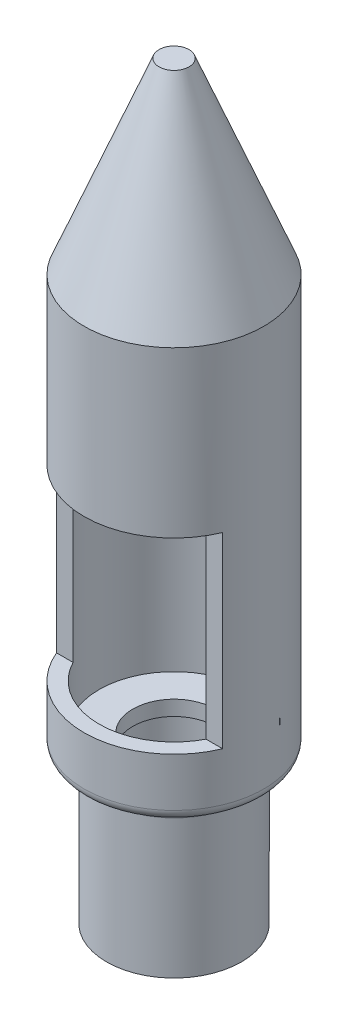
ISO-10303-21;
HEADER;
FILE_DESCRIPTION(('STEP AP214'),'2;1');
FILE_NAME('part.step','',(''),(''),'','','');
FILE_SCHEMA(('AUTOMOTIVE_DESIGN { 1 0 10303 214 1 1 1 1 }'));
ENDSEC;
DATA;
#1=APPLICATION_CONTEXT('core data for automotive mechanical design processes');
#2=APPLICATION_PROTOCOL_DEFINITION('international standard','automotive_design',2000,#1);
#3=PRODUCT_CONTEXT('',#1,'mechanical');
#4=PRODUCT('Part','Part','',(#3));
#5=PRODUCT_RELATED_PRODUCT_CATEGORY('part','',(#4));
#6=PRODUCT_DEFINITION_FORMATION('','',#4);
#7=PRODUCT_DEFINITION_CONTEXT('part definition',#1,'design');
#8=PRODUCT_DEFINITION('design','',#6,#7);
#9=PRODUCT_DEFINITION_SHAPE('','',#8);
#10=(LENGTH_UNIT() NAMED_UNIT(*) SI_UNIT(.MILLI.,.METRE.));
#11=(NAMED_UNIT(*) PLANE_ANGLE_UNIT() SI_UNIT($,.RADIAN.));
#12=(NAMED_UNIT(*) SI_UNIT($,.STERADIAN.) SOLID_ANGLE_UNIT());
#13=UNCERTAINTY_MEASURE_WITH_UNIT(LENGTH_MEASURE(1.E-05),#10,'distance_accuracy_value','');
#14=(GEOMETRIC_REPRESENTATION_CONTEXT(3) GLOBAL_UNCERTAINTY_ASSIGNED_CONTEXT((#13)) GLOBAL_UNIT_ASSIGNED_CONTEXT((#10,
#11,#12)) REPRESENTATION_CONTEXT('',''));
#15=CARTESIAN_POINT('',(0.,0.,0.));
#16=DIRECTION('',(0.,0.,1.));
#17=DIRECTION('',(1.,0.,0.));
#18=AXIS2_PLACEMENT_3D('',#15,#16,#17);
#19=CARTESIAN_POINT('',(0.,55.,0.));
#20=DIRECTION('',(0.,-1.,0.));
#21=DIRECTION('',(0.,0.,-1.));
#22=AXIS2_PLACEMENT_3D('',#19,#20,#21);
#23=CYLINDRICAL_SURFACE('',#22,10.);
#24=DIRECTION('',(0.,-1.,0.));
#25=VECTOR('',#24,1.);
#26=CARTESIAN_POINT('',(8.87918915216924,55.,4.6));
#27=LINE('',#26,#25);
#28=CARTESIAN_POINT('',(8.87918915216923,33.,4.6));
#29=VERTEX_POINT('',#28);
#30=CARTESIAN_POINT('',(8.87918915216925,8.,4.6));
#31=VERTEX_POINT('',#30);
#32=EDGE_CURVE('E112',#29,#31,#27,.T.);
#33=ORIENTED_EDGE('',*,*,#32,.F.);
#34=CARTESIAN_POINT('',(0.,33.,0.));
#35=DIRECTION('',(0.,1.,0.));
#36=DIRECTION('',(0.,0.,1.));
#37=AXIS2_PLACEMENT_3D('',#34,#35,#36);
#38=CIRCLE('',#37,10.);
#39=CARTESIAN_POINT('',(-8.87918915216924,33.,4.6));
#40=VERTEX_POINT('',#39);
#41=EDGE_CURVE('E115',#40,#29,#38,.T.);
#42=ORIENTED_EDGE('',*,*,#41,.F.);
#43=DIRECTION('',(0.,-1.,0.));
#44=VECTOR('',#43,1.);
#45=CARTESIAN_POINT('',(-8.87918915216924,55.,4.6));
#46=LINE('',#45,#44);
#47=CARTESIAN_POINT('',(-8.87918915216925,8.,4.6));
#48=VERTEX_POINT('',#47);
#49=EDGE_CURVE('E110',#48,#40,#46,.F.);
#50=ORIENTED_EDGE('',*,*,#49,.F.);
#51=CARTESIAN_POINT('',(0.,8.,0.));
#52=DIRECTION('',(0.,-1.,0.));
#53=DIRECTION('',(0.,0.,-1.));
#54=AXIS2_PLACEMENT_3D('',#51,#52,#53);
#55=CIRCLE('',#54,10.);
#56=EDGE_CURVE('E103',#31,#48,#55,.T.);
#57=ORIENTED_EDGE('',*,*,#56,.F.);
#58=EDGE_LOOP('',(#33,#42,#50,#57));
#59=FACE_BOUND('',#58,.T.);
#60=CARTESIAN_POINT('',(0.,54.6148351928655,0.));
#61=DIRECTION('',(0.,-1.,0.));
#62=DIRECTION('',(0.,0.,-1.));
#63=AXIS2_PLACEMENT_3D('',#60,#61,#62);
#64=CIRCLE('',#63,10.);
#65=CARTESIAN_POINT('',(0.,54.6148351928655,-10.));
#66=VERTEX_POINT('',#65);
#67=EDGE_CURVE('E190',#66,#66,#64,.F.);
#68=ORIENTED_EDGE('',*,*,#67,.T.);
#69=EDGE_LOOP('',(#68));
#70=FACE_BOUND('',#69,.T.);
#71=CARTESIAN_POINT('',(0.,2.,0.));
#72=DIRECTION('',(0.,1.,0.));
#73=DIRECTION('',(0.,0.,1.));
#74=AXIS2_PLACEMENT_3D('',#71,#72,#73);
#75=CIRCLE('',#74,10.);
#76=CARTESIAN_POINT('',(0.,2.,10.));
#77=VERTEX_POINT('',#76);
#78=EDGE_CURVE('E193',#77,#77,#75,.T.);
#79=ORIENTED_EDGE('',*,*,#78,.F.);
#80=EDGE_LOOP('',(#79));
#81=FACE_BOUND('',#80,.T.);
#82=ADVANCED_FACE('F41',(#59,#70,#81),#23,.F.);
#83=CARTESIAN_POINT('',(0.,2.,0.));
#84=DIRECTION('',(0.,1.,0.));
#85=DIRECTION('',(0.,0.,1.));
#86=AXIS2_PLACEMENT_3D('',#83,#84,#85);
#87=PLANE('',#86);
#88=CARTESIAN_POINT('',(0.,2.,0.));
#89=DIRECTION('',(0.,1.,0.));
#90=DIRECTION('',(0.,0.,1.));
#91=AXIS2_PLACEMENT_3D('',#88,#89,#90);
#92=CIRCLE('',#91,5.5);
#93=CARTESIAN_POINT('',(0.,2.,5.5));
#94=VERTEX_POINT('',#93);
#95=EDGE_CURVE('E121',#94,#94,#92,.T.);
#96=ORIENTED_EDGE('',*,*,#95,.F.);
#97=EDGE_LOOP('',(#96));
#98=FACE_BOUND('',#97,.T.);
#99=ORIENTED_EDGE('',*,*,#78,.T.);
#100=EDGE_LOOP('',(#99));
#101=FACE_BOUND('',#100,.T.);
#102=ADVANCED_FACE('F166',(#98,#101),#87,.T.);
#103=CARTESIAN_POINT('',(0.,79.2572186472918,0.));
#104=DIRECTION('',(0.,-1.,0.));
#105=DIRECTION('',(0.,0.,-1.));
#106=AXIS2_PLACEMENT_3D('',#103,#104,#105);
#107=CONICAL_SURFACE('',#106,0.143046618229482,0.380506377112365);
#108=CARTESIAN_POINT('',(0.,79.6148351928655,0.));
#109=VERTEX_POINT('',#108);
#110=VERTEX_LOOP('',#109);
#111=FACE_BOUND('',#110,.T.);
#112=ORIENTED_EDGE('',*,*,#67,.F.);
#113=EDGE_LOOP('',(#112));
#114=FACE_BOUND('',#113,.T.);
#115=ADVANCED_FACE('F170',(#111,#114),#107,.F.);
#116=CARTESIAN_POINT('',(0.,4.,0.));
#117=DIRECTION('',(0.,-1.,0.));
#118=DIRECTION('',(0.,0.,-1.));
#119=AXIS2_PLACEMENT_3D('',#116,#117,#118);
#120=CYLINDRICAL_SURFACE('',#119,5.5);
#121=ORIENTED_EDGE('',*,*,#95,.T.);
#122=EDGE_LOOP('',(#121));
#123=FACE_BOUND('',#122,.T.);
#124=CARTESIAN_POINT('',(0.,0.,0.));
#125=DIRECTION('',(0.,-1.,0.));
#126=DIRECTION('',(0.,0.,-1.));
#127=AXIS2_PLACEMENT_3D('',#124,#125,#126);
#128=CIRCLE('',#127,5.5);
#129=CARTESIAN_POINT('',(0.,0.,-5.5));
#130=VERTEX_POINT('',#129);
#131=EDGE_CURVE('E118',#130,#130,#128,.T.);
#132=ORIENTED_EDGE('',*,*,#131,.T.);
#133=EDGE_LOOP('',(#132));
#134=FACE_BOUND('',#133,.T.);
#135=ADVANCED_FACE('F162',(#123,#134),#120,.F.);
#136=CARTESIAN_POINT('',(0.,55.,0.));
#137=DIRECTION('',(0.,-1.,0.));
#138=DIRECTION('',(0.,0.,-1.));
#139=AXIS2_PLACEMENT_3D('',#136,#137,#138);
#140=CYLINDRICAL_SURFACE('',#139,12.);
#141=CARTESIAN_POINT('',(0.,1.5,0.));
#142=DIRECTION('',(0.,1.,0.));
#143=DIRECTION('',(0.,0.,1.));
#144=AXIS2_PLACEMENT_3D('',#141,#142,#143);
#145=CIRCLE('',#144,12.);
#146=CARTESIAN_POINT('',(0.,1.5,12.));
#147=VERTEX_POINT('',#146);
#148=EDGE_CURVE('E50',#147,#147,#145,.T.);
#149=ORIENTED_EDGE('',*,*,#148,.T.);
#150=EDGE_LOOP('',(#149));
#151=FACE_BOUND('',#150,.T.);
#152=CARTESIAN_POINT('',(0.,33.,0.));
#153=DIRECTION('',(0.,1.,0.));
#154=DIRECTION('',(0.,0.,1.));
#155=AXIS2_PLACEMENT_3D('',#152,#153,#154);
#156=CIRCLE('',#155,12.);
#157=CARTESIAN_POINT('',(-11.0833208019979,33.,4.6));
#158=VERTEX_POINT('',#157);
#159=CARTESIAN_POINT('',(11.0833208019979,33.,4.6));
#160=VERTEX_POINT('',#159);
#161=EDGE_CURVE('E60',#158,#160,#156,.T.);
#162=ORIENTED_EDGE('',*,*,#161,.T.);
#163=DIRECTION('',(0.,-1.,0.));
#164=VECTOR('',#163,1.);
#165=CARTESIAN_POINT('',(11.0833208019979,55.,4.6));
#166=LINE('',#165,#164);
#167=CARTESIAN_POINT('',(11.0833208019979,8.,4.6));
#168=VERTEX_POINT('',#167);
#169=EDGE_CURVE('E86',#160,#168,#166,.T.);
#170=ORIENTED_EDGE('',*,*,#169,.T.);
#171=CARTESIAN_POINT('',(0.,8.,0.));
#172=DIRECTION('',(0.,-1.,0.));
#173=DIRECTION('',(0.,0.,-1.));
#174=AXIS2_PLACEMENT_3D('',#171,#172,#173);
#175=CIRCLE('',#174,12.);
#176=CARTESIAN_POINT('',(-11.0833208019979,8.,4.6));
#177=VERTEX_POINT('',#176);
#178=EDGE_CURVE('E81',#168,#177,#175,.T.);
#179=ORIENTED_EDGE('',*,*,#178,.T.);
#180=DIRECTION('',(0.,-1.,0.));
#181=VECTOR('',#180,1.);
#182=CARTESIAN_POINT('',(-11.0833208019979,55.,4.6));
#183=LINE('',#182,#181);
#184=EDGE_CURVE('E85',#177,#158,#183,.F.);
#185=ORIENTED_EDGE('',*,*,#184,.T.);
#186=EDGE_LOOP('',(#162,#170,#179,#185));
#187=FACE_BOUND('',#186,.T.);
#188=CARTESIAN_POINT('',(0.,55.,0.));
#189=DIRECTION('',(0.,-1.,0.));
#190=DIRECTION('',(0.,0.,-1.));
#191=AXIS2_PLACEMENT_3D('',#188,#189,#190);
#192=CIRCLE('',#191,12.);
#193=CARTESIAN_POINT('',(0.,55.,-12.));
#194=VERTEX_POINT('',#193);
#195=EDGE_CURVE('E196',#194,#194,#192,.F.);
#196=ORIENTED_EDGE('',*,*,#195,.F.);
#197=EDGE_LOOP('',(#196));
#198=FACE_BOUND('',#197,.T.);
#199=ADVANCED_FACE('F83',(#151,#187,#198),#140,.T.);
#200=CARTESIAN_POINT('',(0.,80.,0.));
#201=DIRECTION('',(0.,1.,0.));
#202=DIRECTION('',(0.,0.,1.));
#203=AXIS2_PLACEMENT_3D('',#200,#201,#202);
#204=PLANE('',#203);
#205=CARTESIAN_POINT('',(0.,80.,0.));
#206=DIRECTION('',(0.,1.,0.));
#207=DIRECTION('',(0.,0.,1.));
#208=AXIS2_PLACEMENT_3D('',#205,#206,#207);
#209=CIRCLE('',#208,2.);
#210=CARTESIAN_POINT('',(0.,80.,-2.));
#211=VERTEX_POINT('',#210);
#212=EDGE_CURVE('E131',#211,#211,#209,.T.);
#213=ORIENTED_EDGE('',*,*,#212,.T.);
#214=EDGE_LOOP('',(#213));
#215=FACE_BOUND('',#214,.T.);
#216=ADVANCED_FACE('F152',(#215),#204,.T.);
#217=CARTESIAN_POINT('',(0.,80.,0.));
#218=DIRECTION('',(0.,-1.,0.));
#219=DIRECTION('',(0.,0.,-1.));
#220=AXIS2_PLACEMENT_3D('',#217,#218,#219);
#221=CONICAL_SURFACE('',#220,2.,0.380506377112365);
#222=CARTESIAN_POINT('',(0.,80.,-2.));
#223=CARTESIAN_POINT('',(0.,79.7395833333333,-2.10416666666667));
#224=CARTESIAN_POINT('',(0.,79.4791666666667,-2.20833333333334));
#225=CARTESIAN_POINT('',(0.,78.9583333333333,-2.41666666666667));
#226=CARTESIAN_POINT('',(0.,78.6979166666667,-2.52083333333334));
#227=CARTESIAN_POINT('',(0.,78.1770833333333,-2.72916666666667));
#228=CARTESIAN_POINT('',(0.,77.9166666666667,-2.83333333333334));
#229=CARTESIAN_POINT('',(0.,77.3958333333333,-3.04166666666667));
#230=CARTESIAN_POINT('',(0.,77.1354166666667,-3.14583333333334));
#231=CARTESIAN_POINT('',(0.,76.6145833333333,-3.35416666666667));
#232=CARTESIAN_POINT('',(0.,76.3541666666667,-3.45833333333334));
#233=CARTESIAN_POINT('',(0.,75.8333333333333,-3.66666666666667));
#234=CARTESIAN_POINT('',(0.,75.5729166666667,-3.77083333333334));
#235=CARTESIAN_POINT('',(0.,75.0520833333333,-3.97916666666667));
#236=CARTESIAN_POINT('',(0.,74.7916666666667,-4.08333333333334));
#237=CARTESIAN_POINT('',(0.,74.2708333333333,-4.29166666666667));
#238=CARTESIAN_POINT('',(0.,74.0104166666667,-4.39583333333334));
#239=CARTESIAN_POINT('',(0.,73.4895833333333,-4.60416666666667));
#240=CARTESIAN_POINT('',(0.,73.2291666666667,-4.70833333333334));
#241=CARTESIAN_POINT('',(0.,72.7083333333333,-4.91666666666667));
#242=CARTESIAN_POINT('',(0.,72.4479166666667,-5.02083333333334));
#243=CARTESIAN_POINT('',(0.,71.9270833333333,-5.22916666666667));
#244=CARTESIAN_POINT('',(0.,71.6666666666667,-5.33333333333334));
#245=CARTESIAN_POINT('',(0.,71.1458333333333,-5.54166666666667));
#246=CARTESIAN_POINT('',(0.,70.8854166666667,-5.64583333333333));
#247=CARTESIAN_POINT('',(0.,70.3645833333333,-5.85416666666667));
#248=CARTESIAN_POINT('',(0.,70.1041666666667,-5.95833333333334));
#249=CARTESIAN_POINT('',(0.,69.5833333333333,-6.16666666666667));
#250=CARTESIAN_POINT('',(0.,69.3229166666667,-6.27083333333334));
#251=CARTESIAN_POINT('',(0.,68.8020833333333,-6.47916666666667));
#252=CARTESIAN_POINT('',(0.,68.5416666666667,-6.58333333333333));
#253=CARTESIAN_POINT('',(0.,68.0208333333333,-6.79166666666667));
#254=CARTESIAN_POINT('',(0.,67.7604166666667,-6.89583333333334));
#255=CARTESIAN_POINT('',(0.,67.2395833333333,-7.10416666666667));
#256=CARTESIAN_POINT('',(0.,66.9791666666667,-7.20833333333333));
#257=CARTESIAN_POINT('',(0.,66.4583333333333,-7.41666666666667));
#258=CARTESIAN_POINT('',(0.,66.1979166666667,-7.52083333333333));
#259=CARTESIAN_POINT('',(0.,65.6770833333333,-7.72916666666667));
#260=CARTESIAN_POINT('',(0.,65.4166666666667,-7.83333333333333));
#261=CARTESIAN_POINT('',(0.,64.8958333333333,-8.04166666666667));
#262=CARTESIAN_POINT('',(0.,64.6354166666667,-8.14583333333333));
#263=CARTESIAN_POINT('',(0.,64.1145833333333,-8.35416666666667));
#264=CARTESIAN_POINT('',(0.,63.8541666666667,-8.45833333333334));
#265=CARTESIAN_POINT('',(0.,63.3333333333333,-8.66666666666667));
#266=CARTESIAN_POINT('',(0.,63.0729166666667,-8.77083333333333));
#267=CARTESIAN_POINT('',(0.,62.5520833333333,-8.97916666666667));
#268=CARTESIAN_POINT('',(0.,62.2916666666667,-9.08333333333333));
#269=CARTESIAN_POINT('',(0.,61.7708333333333,-9.29166666666667));
#270=CARTESIAN_POINT('',(0.,61.5104166666667,-9.39583333333333));
#271=CARTESIAN_POINT('',(0.,60.9895833333333,-9.60416666666667));
#272=CARTESIAN_POINT('',(0.,60.7291666666667,-9.70833333333334));
#273=CARTESIAN_POINT('',(0.,60.2083333333333,-9.91666666666667));
#274=CARTESIAN_POINT('',(0.,59.9479166666667,-10.0208333333333));
#275=CARTESIAN_POINT('',(0.,59.4270833333333,-10.2291666666667));
#276=CARTESIAN_POINT('',(0.,59.1666666666667,-10.3333333333333));
#277=CARTESIAN_POINT('',(0.,58.6458333333333,-10.5416666666667));
#278=CARTESIAN_POINT('',(0.,58.3854166666667,-10.6458333333333));
#279=CARTESIAN_POINT('',(0.,57.8645833333333,-10.8541666666667));
#280=CARTESIAN_POINT('',(0.,57.6041666666667,-10.9583333333333));
#281=CARTESIAN_POINT('',(0.,57.0833333333333,-11.1666666666667));
#282=CARTESIAN_POINT('',(0.,56.8229166666667,-11.2708333333333));
#283=CARTESIAN_POINT('',(0.,56.3020833333333,-11.4791666666667));
#284=CARTESIAN_POINT('',(0.,56.0416666666667,-11.5833333333333));
#285=CARTESIAN_POINT('',(0.,55.5208333333333,-11.7916666666667));
#286=CARTESIAN_POINT('',(0.,55.2604166666667,-11.8958333333333));
#287=CARTESIAN_POINT('',(0.,55.,-12.));
#288=B_SPLINE_CURVE_WITH_KNOTS('',3,(#222,#223,#224,#225,#226,#227,#228,#229,#230,#231,#232,
#233,#234,#235,#236,#237,#238,#239,#240,#241,#242,#243,#244,#245,#246,#247,#248,#249,#250,#251,
#252,#253,#254,#255,#256,#257,#258,#259,#260,#261,#262,#263,#264,#265,#266,#267,#268,#269,#270,
#271,#272,#273,#274,#275,#276,#277,#278,#279,#280,#281,#282,#283,#284,#285,#286,#287),
.UNSPECIFIED.,.F.,.F.,(4,2,2,2,2,2,2,2,2,2,2,2,2,2,2,2,2,2,2,2,2,2,2,2,2,2,2,2,2,2,2,2,4),(0.,
0.841432001114777,1.68286400222954,2.5242960033443,3.36572800445907,4.20716000557383,
5.04859200668861,5.89002400780337,6.73145600891813,7.5728880100329,8.41432001114766,
9.25575201226243,10.0971840133772,10.938616014492,11.7800480156067,12.6214800167215,
13.4629120178363,14.304344018951,15.1457760200658,15.9872080211806,16.8286400222953,
17.6700720234101,18.5115040245249,19.3529360256396,20.1943680267544,21.0358000278692,
21.8772320289839,22.7186640300987,23.5600960312135,24.4015280323282,25.242960033443,
26.0843920345578,26.9258240356725),.UNSPECIFIED.);
#289=EDGE_CURVE('BSEAM141',#211,#194,#288,.T.);
#290=ORIENTED_EDGE('',*,*,#212,.F.);
#291=ORIENTED_EDGE('',*,*,#195,.T.);
#292=ORIENTED_EDGE('',*,*,#289,.T.);
#293=ORIENTED_EDGE('',*,*,#289,.F.);
#294=EDGE_LOOP('',(#290,#292,#291,#293));
#295=FACE_BOUND('',#294,.T.);
#296=ADVANCED_FACE('F141',(#295),#221,.T.);
#297=CARTESIAN_POINT('',(0.,-20.,0.));
#298=DIRECTION('',(0.,-1.,0.));
#299=DIRECTION('',(0.,0.,-1.));
#300=AXIS2_PLACEMENT_3D('',#297,#298,#299);
#301=PLANE('',#300);
#302=CARTESIAN_POINT('',(0.,-20.,0.));
#303=DIRECTION('',(0.,-1.,0.));
#304=DIRECTION('',(0.,0.,-1.));
#305=AXIS2_PLACEMENT_3D('',#302,#303,#304);
#306=CIRCLE('',#305,9.);
#307=CARTESIAN_POINT('',(0.,-20.,-9.));
#308=VERTEX_POINT('',#307);
#309=EDGE_CURVE('E125',#308,#308,#306,.T.);
#310=ORIENTED_EDGE('',*,*,#309,.T.);
#311=EDGE_LOOP('',(#310));
#312=FACE_BOUND('',#311,.T.);
#313=CARTESIAN_POINT('',(0.,-20.,0.));
#314=DIRECTION('',(0.,-1.,0.));
#315=DIRECTION('',(0.,0.,-1.));
#316=AXIS2_PLACEMENT_3D('',#313,#314,#315);
#317=CIRCLE('',#316,7.);
#318=CARTESIAN_POINT('',(0.,-20.,-7.));
#319=VERTEX_POINT('',#318);
#320=EDGE_CURVE('E122',#319,#319,#317,.T.);
#321=ORIENTED_EDGE('',*,*,#320,.F.);
#322=EDGE_LOOP('',(#321));
#323=FACE_BOUND('',#322,.T.);
#324=ADVANCED_FACE('F151',(#312,#323),#301,.T.);
#325=CARTESIAN_POINT('',(0.,-20.,0.));
#326=DIRECTION('',(0.,1.,0.));
#327=DIRECTION('',(0.,0.,1.));
#328=AXIS2_PLACEMENT_3D('',#325,#326,#327);
#329=CYLINDRICAL_SURFACE('',#328,9.);
#330=CARTESIAN_POINT('',(0.,-1.5,0.));
#331=DIRECTION('',(0.,1.,0.));
#332=DIRECTION('',(0.,0.,1.));
#333=AXIS2_PLACEMENT_3D('',#330,#331,#332);
#334=CIRCLE('',#333,9.);
#335=CARTESIAN_POINT('',(0.,-1.5,9.));
#336=VERTEX_POINT('',#335);
#337=EDGE_CURVE('E12',#336,#336,#334,.F.);
#338=ORIENTED_EDGE('',*,*,#337,.T.);
#339=EDGE_LOOP('',(#338));
#340=FACE_BOUND('',#339,.T.);
#341=ORIENTED_EDGE('',*,*,#309,.F.);
#342=EDGE_LOOP('',(#341));
#343=FACE_BOUND('',#342,.T.);
#344=ADVANCED_FACE('F230',(#340,#343),#329,.T.);
#345=CARTESIAN_POINT('',(0.,-20.,0.));
#346=DIRECTION('',(0.,1.,0.));
#347=DIRECTION('',(0.,0.,1.));
#348=AXIS2_PLACEMENT_3D('',#345,#346,#347);
#349=CYLINDRICAL_SURFACE('',#348,7.);
#350=ORIENTED_EDGE('',*,*,#320,.T.);
#351=EDGE_LOOP('',(#350));
#352=FACE_BOUND('',#351,.T.);
#353=CARTESIAN_POINT('',(0.,0.,0.));
#354=DIRECTION('',(0.,-1.,0.));
#355=DIRECTION('',(0.,0.,-1.));
#356=AXIS2_PLACEMENT_3D('',#353,#354,#355);
#357=CIRCLE('',#356,7.);
#358=CARTESIAN_POINT('',(0.,0.,-7.));
#359=VERTEX_POINT('',#358);
#360=EDGE_CURVE('E126',#359,#359,#357,.T.);
#361=ORIENTED_EDGE('',*,*,#360,.F.);
#362=EDGE_LOOP('',(#361));
#363=FACE_BOUND('',#362,.T.);
#364=ADVANCED_FACE('F158',(#352,#363),#349,.F.);
#365=CARTESIAN_POINT('',(0.,0.,0.));
#366=DIRECTION('',(0.,1.,0.));
#367=DIRECTION('',(0.,0.,1.));
#368=AXIS2_PLACEMENT_3D('',#365,#366,#367);
#369=PLANE('',#368);
#370=ORIENTED_EDGE('',*,*,#131,.F.);
#371=EDGE_LOOP('',(#370));
#372=FACE_BOUND('',#371,.T.);
#373=ORIENTED_EDGE('',*,*,#360,.T.);
#374=EDGE_LOOP('',(#373));
#375=FACE_BOUND('',#374,.T.);
#376=ADVANCED_FACE('F155',(#372,#375),#369,.F.);
#377=CARTESIAN_POINT('',(-10.,8.,8.));
#378=DIRECTION('',(0.,-1.,0.));
#379=DIRECTION('',(0.,0.,-1.));
#380=AXIS2_PLACEMENT_3D('',#377,#378,#379);
#381=PLANE('',#380);
#382=ORIENTED_EDGE('',*,*,#56,.T.);
#383=DIRECTION('',(1.,0.,0.));
#384=VECTOR('',#383,1.);
#385=CARTESIAN_POINT('',(-12.000012,8.,4.6));
#386=LINE('',#385,#384);
#387=EDGE_CURVE('E97',#177,#48,#386,.T.);
#388=ORIENTED_EDGE('',*,*,#387,.F.);
#389=ORIENTED_EDGE('',*,*,#178,.F.);
#390=EDGE_CURVE('E105',#31,#168,#386,.T.);
#391=ORIENTED_EDGE('',*,*,#390,.F.);
#392=EDGE_LOOP('',(#382,#388,#389,#391));
#393=FACE_BOUND('',#392,.T.);
#394=ADVANCED_FACE('F102',(#393),#381,.F.);
#395=CARTESIAN_POINT('',(-10.,33.,8.));
#396=DIRECTION('',(0.,1.,0.));
#397=DIRECTION('',(0.,0.,1.));
#398=AXIS2_PLACEMENT_3D('',#395,#396,#397);
#399=PLANE('',#398);
#400=ORIENTED_EDGE('',*,*,#41,.T.);
#401=DIRECTION('',(1.,0.,0.));
#402=VECTOR('',#401,1.);
#403=CARTESIAN_POINT('',(-12.000012,33.,4.6));
#404=LINE('',#403,#402);
#405=EDGE_CURVE('E104',#29,#160,#404,.T.);
#406=ORIENTED_EDGE('',*,*,#405,.T.);
#407=ORIENTED_EDGE('',*,*,#161,.F.);
#408=EDGE_CURVE('E100',#158,#40,#404,.T.);
#409=ORIENTED_EDGE('',*,*,#408,.T.);
#410=EDGE_LOOP('',(#400,#406,#407,#409));
#411=FACE_BOUND('',#410,.T.);
#412=ADVANCED_FACE('F259',(#411),#399,.F.);
#413=CARTESIAN_POINT('',(-12.000012,33.,4.6));
#414=DIRECTION('',(0.,0.,-1.));
#415=DIRECTION('',(0.,1.,0.));
#416=AXIS2_PLACEMENT_3D('',#413,#414,#415);
#417=PLANE('',#416);
#418=ORIENTED_EDGE('',*,*,#49,.T.);
#419=ORIENTED_EDGE('',*,*,#408,.F.);
#420=ORIENTED_EDGE('',*,*,#184,.F.);
#421=ORIENTED_EDGE('',*,*,#387,.T.);
#422=EDGE_LOOP('',(#418,#419,#420,#421));
#423=FACE_BOUND('',#422,.T.);
#424=ADVANCED_FACE('F96',(#423),#417,.F.);
#425=ORIENTED_EDGE('',*,*,#32,.T.);
#426=ORIENTED_EDGE('',*,*,#390,.T.);
#427=ORIENTED_EDGE('',*,*,#169,.F.);
#428=ORIENTED_EDGE('',*,*,#405,.F.);
#429=EDGE_LOOP('',(#425,#426,#427,#428));
#430=FACE_BOUND('',#429,.T.);
#431=ADVANCED_FACE('F179',(#430),#417,.F.);
#432=CARTESIAN_POINT('',(0.,-1.5,0.));
#433=DIRECTION('',(0.,1.,0.));
#434=DIRECTION('',(0.,0.,1.));
#435=AXIS2_PLACEMENT_3D('',#432,#433,#434);
#436=TOROIDAL_SURFACE('',#435,10.5,1.5);
#437=ORIENTED_EDGE('',*,*,#337,.F.);
#438=EDGE_LOOP('',(#437));
#439=FACE_BOUND('',#438,.T.);
#440=CARTESIAN_POINT('',(0.,0.,0.));
#441=DIRECTION('',(0.,1.,0.));
#442=DIRECTION('',(0.,0.,1.));
#443=AXIS2_PLACEMENT_3D('',#440,#441,#442);
#444=CIRCLE('',#443,10.5);
#445=CARTESIAN_POINT('',(0.,0.,10.5));
#446=VERTEX_POINT('',#445);
#447=EDGE_CURVE('E45',#446,#446,#444,.T.);
#448=ORIENTED_EDGE('',*,*,#447,.F.);
#449=EDGE_LOOP('',(#448));
#450=FACE_BOUND('',#449,.T.);
#451=ADVANCED_FACE('F43',(#439,#450),#436,.F.);
#452=CARTESIAN_POINT('',(0.,1.5,0.));
#453=DIRECTION('',(0.,1.,0.));
#454=DIRECTION('',(0.,0.,1.));
#455=AXIS2_PLACEMENT_3D('',#452,#453,#454);
#456=TOROIDAL_SURFACE('',#455,10.5,1.5);
#457=ORIENTED_EDGE('',*,*,#447,.T.);
#458=EDGE_LOOP('',(#457));
#459=FACE_BOUND('',#458,.T.);
#460=ORIENTED_EDGE('',*,*,#148,.F.);
#461=EDGE_LOOP('',(#460));
#462=FACE_BOUND('',#461,.T.);
#463=ADVANCED_FACE('F173',(#459,#462),#456,.T.);
#464=CLOSED_SHELL('',(#82,#102,#115,#135,#199,#216,#296,#324,#344,#364,#376,#394,#412,#424,#431,
#451,#463));
#465=MANIFOLD_SOLID_BREP('B2',#464);
#466=ADVANCED_BREP_SHAPE_REPRESENTATION('',(#18,#465),#14);
#467=SHAPE_DEFINITION_REPRESENTATION(#9,#466);
ENDSEC;
END-ISO-10303-21;
